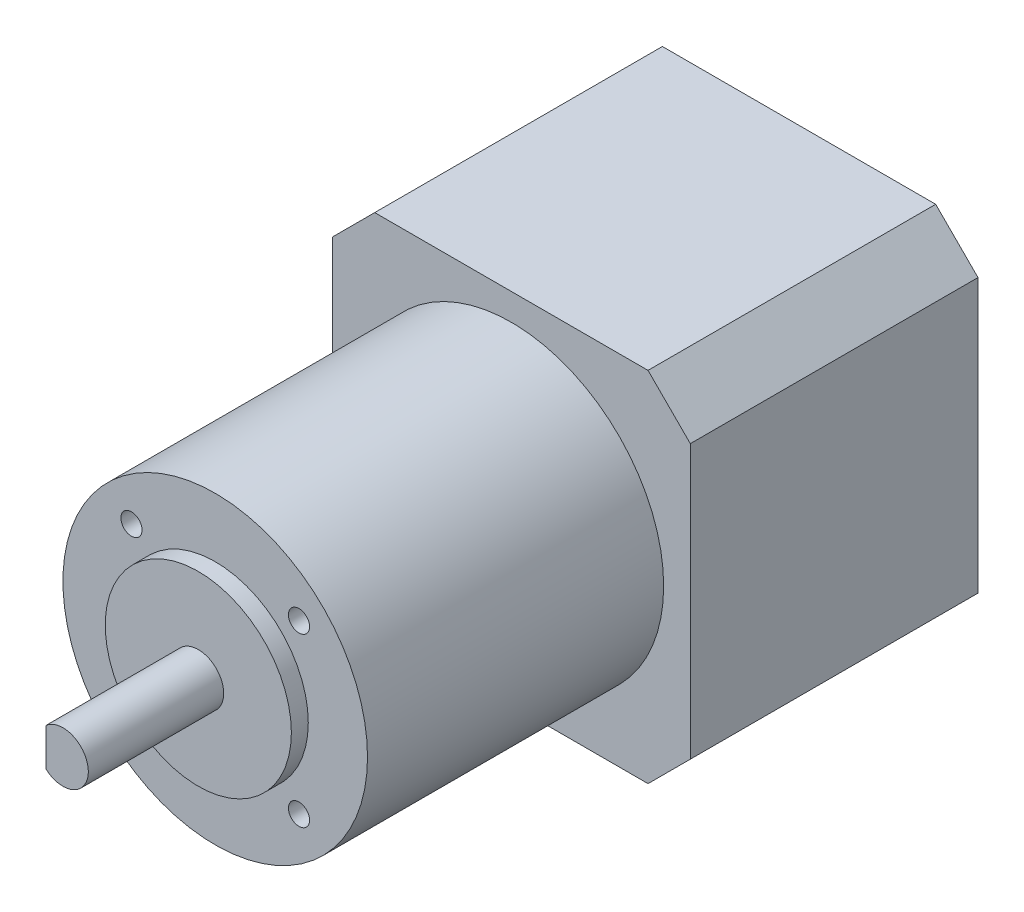
ISO-10303-21;
HEADER;
FILE_DESCRIPTION(('STEP AP214'),'2;1');
FILE_NAME('part.step','',(''),(''),'','','');
FILE_SCHEMA(('AUTOMOTIVE_DESIGN { 1 0 10303 214 1 1 1 1 }'));
ENDSEC;
DATA;
#1=APPLICATION_CONTEXT('core data for automotive mechanical design processes');
#2=APPLICATION_PROTOCOL_DEFINITION('international standard','automotive_design',2000,#1);
#3=PRODUCT_CONTEXT('',#1,'mechanical');
#4=PRODUCT('Part','Part','',(#3));
#5=PRODUCT_RELATED_PRODUCT_CATEGORY('part','',(#4));
#6=PRODUCT_DEFINITION_FORMATION('','',#4);
#7=PRODUCT_DEFINITION_CONTEXT('part definition',#1,'design');
#8=PRODUCT_DEFINITION('design','',#6,#7);
#9=PRODUCT_DEFINITION_SHAPE('','',#8);
#10=(LENGTH_UNIT() NAMED_UNIT(*) SI_UNIT(.MILLI.,.METRE.));
#11=(NAMED_UNIT(*) PLANE_ANGLE_UNIT() SI_UNIT($,.RADIAN.));
#12=(NAMED_UNIT(*) SI_UNIT($,.STERADIAN.) SOLID_ANGLE_UNIT());
#13=UNCERTAINTY_MEASURE_WITH_UNIT(LENGTH_MEASURE(1.E-05),#10,'distance_accuracy_value','');
#14=(GEOMETRIC_REPRESENTATION_CONTEXT(3) GLOBAL_UNCERTAINTY_ASSIGNED_CONTEXT((#13)) GLOBAL_UNIT_ASSIGNED_CONTEXT((#10,
#11,#12)) REPRESENTATION_CONTEXT('',''));
#15=CARTESIAN_POINT('',(0.,0.,0.));
#16=DIRECTION('',(0.,0.,1.));
#17=DIRECTION('',(1.,0.,0.));
#18=AXIS2_PLACEMENT_3D('',#15,#16,#17);
#19=CARTESIAN_POINT('',(-21.15,-21.15,34.));
#20=DIRECTION('',(-1.,0.,0.));
#21=DIRECTION('',(0.,0.,1.));
#22=AXIS2_PLACEMENT_3D('',#19,#20,#21);
#23=PLANE('',#22);
#24=DIRECTION('',(0.,1.,0.));
#25=VECTOR('',#24,1.);
#26=CARTESIAN_POINT('',(-21.15,-21.15,0.));
#27=LINE('',#26,#25);
#28=CARTESIAN_POINT('',(-21.15,-16.15,0.));
#29=VERTEX_POINT('',#28);
#30=CARTESIAN_POINT('',(-21.15,16.15,0.));
#31=VERTEX_POINT('',#30);
#32=EDGE_CURVE('E197',#29,#31,#27,.T.);
#33=ORIENTED_EDGE('',*,*,#32,.F.);
#34=DIRECTION('',(0.,0.,1.));
#35=VECTOR('',#34,1.);
#36=CARTESIAN_POINT('',(-21.15,-16.15,34.));
#37=LINE('',#36,#35);
#38=CARTESIAN_POINT('',(-21.15,-16.15,34.));
#39=VERTEX_POINT('',#38);
#40=EDGE_CURVE('E236',#29,#39,#37,.T.);
#41=ORIENTED_EDGE('',*,*,#40,.T.);
#42=DIRECTION('',(0.,1.,0.));
#43=VECTOR('',#42,1.);
#44=CARTESIAN_POINT('',(-21.15,-21.15,34.));
#45=LINE('',#44,#43);
#46=CARTESIAN_POINT('',(-21.15,16.15,34.));
#47=VERTEX_POINT('',#46);
#48=EDGE_CURVE('E201',#39,#47,#45,.T.);
#49=ORIENTED_EDGE('',*,*,#48,.T.);
#50=DIRECTION('',(0.,0.,-1.));
#51=VECTOR('',#50,1.);
#52=CARTESIAN_POINT('',(-21.15,16.15,34.));
#53=LINE('',#52,#51);
#54=EDGE_CURVE('E233',#47,#31,#53,.T.);
#55=ORIENTED_EDGE('',*,*,#54,.T.);
#56=EDGE_LOOP('',(#33,#41,#49,#55));
#57=FACE_BOUND('',#56,.T.);
#58=ADVANCED_FACE('F47',(#57),#23,.T.);
#59=CARTESIAN_POINT('',(-21.15,-21.15,34.));
#60=DIRECTION('',(0.,1.,0.));
#61=DIRECTION('',(0.,0.,1.));
#62=AXIS2_PLACEMENT_3D('',#59,#60,#61);
#63=PLANE('',#62);
#64=DIRECTION('',(1.,0.,0.));
#65=VECTOR('',#64,1.);
#66=CARTESIAN_POINT('',(-21.15,-21.15,34.));
#67=LINE('',#66,#65);
#68=CARTESIAN_POINT('',(-16.15,-21.15,34.));
#69=VERTEX_POINT('',#68);
#70=CARTESIAN_POINT('',(16.15,-21.15,34.));
#71=VERTEX_POINT('',#70);
#72=EDGE_CURVE('E200',#69,#71,#67,.T.);
#73=ORIENTED_EDGE('',*,*,#72,.F.);
#74=DIRECTION('',(0.,0.,-1.));
#75=VECTOR('',#74,1.);
#76=CARTESIAN_POINT('',(-16.15,-21.15,0.));
#77=LINE('',#76,#75);
#78=CARTESIAN_POINT('',(-16.15,-21.15,0.));
#79=VERTEX_POINT('',#78);
#80=EDGE_CURVE('E222',#69,#79,#77,.T.);
#81=ORIENTED_EDGE('',*,*,#80,.T.);
#82=DIRECTION('',(1.,0.,0.));
#83=VECTOR('',#82,1.);
#84=CARTESIAN_POINT('',(-21.15,-21.15,0.));
#85=LINE('',#84,#83);
#86=CARTESIAN_POINT('',(16.15,-21.15,0.));
#87=VERTEX_POINT('',#86);
#88=EDGE_CURVE('E205',#79,#87,#85,.T.);
#89=ORIENTED_EDGE('',*,*,#88,.T.);
#90=DIRECTION('',(0.,0.,1.));
#91=VECTOR('',#90,1.);
#92=CARTESIAN_POINT('',(16.15,-21.15,34.));
#93=LINE('',#92,#91);
#94=EDGE_CURVE('E187',#87,#71,#93,.T.);
#95=ORIENTED_EDGE('',*,*,#94,.T.);
#96=EDGE_LOOP('',(#73,#81,#89,#95));
#97=FACE_BOUND('',#96,.T.);
#98=ADVANCED_FACE('F272',(#97),#63,.F.);
#99=CARTESIAN_POINT('',(21.15,-21.15,34.));
#100=DIRECTION('',(-1.,0.,0.));
#101=DIRECTION('',(0.,0.,1.));
#102=AXIS2_PLACEMENT_3D('',#99,#100,#101);
#103=PLANE('',#102);
#104=DIRECTION('',(0.,1.,0.));
#105=VECTOR('',#104,1.);
#106=CARTESIAN_POINT('',(21.15,-21.15,34.));
#107=LINE('',#106,#105);
#108=CARTESIAN_POINT('',(21.15,-16.15,34.));
#109=VERTEX_POINT('',#108);
#110=CARTESIAN_POINT('',(21.15,16.15,34.));
#111=VERTEX_POINT('',#110);
#112=EDGE_CURVE('E207',#109,#111,#107,.T.);
#113=ORIENTED_EDGE('',*,*,#112,.F.);
#114=DIRECTION('',(0.,0.,-1.));
#115=VECTOR('',#114,1.);
#116=CARTESIAN_POINT('',(21.15,-16.15,34.));
#117=LINE('',#116,#115);
#118=CARTESIAN_POINT('',(21.15,-16.15,0.));
#119=VERTEX_POINT('',#118);
#120=EDGE_CURVE('E247',#109,#119,#117,.T.);
#121=ORIENTED_EDGE('',*,*,#120,.T.);
#122=DIRECTION('',(0.,1.,0.));
#123=VECTOR('',#122,1.);
#124=CARTESIAN_POINT('',(21.15,-21.15,0.));
#125=LINE('',#124,#123);
#126=CARTESIAN_POINT('',(21.15,16.15,0.));
#127=VERTEX_POINT('',#126);
#128=EDGE_CURVE('E216',#119,#127,#125,.T.);
#129=ORIENTED_EDGE('',*,*,#128,.T.);
#130=DIRECTION('',(0.,0.,1.));
#131=VECTOR('',#130,1.);
#132=CARTESIAN_POINT('',(21.15,16.15,34.));
#133=LINE('',#132,#131);
#134=EDGE_CURVE('E245',#127,#111,#133,.T.);
#135=ORIENTED_EDGE('',*,*,#134,.T.);
#136=EDGE_LOOP('',(#113,#121,#129,#135));
#137=FACE_BOUND('',#136,.T.);
#138=ADVANCED_FACE('F280',(#137),#103,.F.);
#139=CARTESIAN_POINT('',(-21.15,21.15,34.));
#140=DIRECTION('',(0.,1.,0.));
#141=DIRECTION('',(0.,0.,1.));
#142=AXIS2_PLACEMENT_3D('',#139,#140,#141);
#143=PLANE('',#142);
#144=DIRECTION('',(1.,0.,0.));
#145=VECTOR('',#144,1.);
#146=CARTESIAN_POINT('',(-21.15,21.15,0.));
#147=LINE('',#146,#145);
#148=CARTESIAN_POINT('',(-16.15,21.15,0.));
#149=VERTEX_POINT('',#148);
#150=CARTESIAN_POINT('',(16.15,21.15,0.));
#151=VERTEX_POINT('',#150);
#152=EDGE_CURVE('E213',#149,#151,#147,.T.);
#153=ORIENTED_EDGE('',*,*,#152,.F.);
#154=DIRECTION('',(0.,0.,1.));
#155=VECTOR('',#154,1.);
#156=CARTESIAN_POINT('',(-16.15,21.15,34.));
#157=LINE('',#156,#155);
#158=CARTESIAN_POINT('',(-16.15,21.15,34.));
#159=VERTEX_POINT('',#158);
#160=EDGE_CURVE('E11',#149,#159,#157,.T.);
#161=ORIENTED_EDGE('',*,*,#160,.T.);
#162=DIRECTION('',(1.,0.,0.));
#163=VECTOR('',#162,1.);
#164=CARTESIAN_POINT('',(-21.15,21.15,34.));
#165=LINE('',#164,#163);
#166=CARTESIAN_POINT('',(16.15,21.15,34.));
#167=VERTEX_POINT('',#166);
#168=EDGE_CURVE('E204',#159,#167,#165,.T.);
#169=ORIENTED_EDGE('',*,*,#168,.T.);
#170=DIRECTION('',(0.,0.,-1.));
#171=VECTOR('',#170,1.);
#172=CARTESIAN_POINT('',(16.15,21.15,0.));
#173=LINE('',#172,#171);
#174=EDGE_CURVE('E56',#167,#151,#173,.T.);
#175=ORIENTED_EDGE('',*,*,#174,.T.);
#176=EDGE_LOOP('',(#153,#161,#169,#175));
#177=FACE_BOUND('',#176,.T.);
#178=ADVANCED_FACE('F251',(#177),#143,.T.);
#179=CARTESIAN_POINT('',(0.,0.,34.));
#180=DIRECTION('',(0.,0.,-1.));
#181=DIRECTION('',(-1.,0.,0.));
#182=AXIS2_PLACEMENT_3D('',#179,#180,#181);
#183=PLANE('',#182);
#184=CARTESIAN_POINT('',(0.,0.,34.));
#185=DIRECTION('',(0.,0.,1.));
#186=DIRECTION('',(1.,0.,0.));
#187=AXIS2_PLACEMENT_3D('',#184,#185,#186);
#188=CIRCLE('',#187,18.);
#189=CARTESIAN_POINT('',(18.,0.,34.));
#190=VERTEX_POINT('',#189);
#191=EDGE_CURVE('E194',#190,#190,#188,.T.);
#192=ORIENTED_EDGE('',*,*,#191,.F.);
#193=EDGE_LOOP('',(#192));
#194=FACE_BOUND('',#193,.T.);
#195=ORIENTED_EDGE('',*,*,#48,.F.);
#196=DIRECTION('',(0.707106781186546,-0.707106781186549,0.));
#197=VECTOR('',#196,1.);
#198=CARTESIAN_POINT('',(-16.15,-21.15,34.));
#199=LINE('',#198,#197);
#200=EDGE_CURVE('E243',#39,#69,#199,.T.);
#201=ORIENTED_EDGE('',*,*,#200,.T.);
#202=ORIENTED_EDGE('',*,*,#72,.T.);
#203=DIRECTION('',(-0.707106781186549,-0.707106781186546,0.));
#204=VECTOR('',#203,1.);
#205=CARTESIAN_POINT('',(21.15,-16.15,34.));
#206=LINE('',#205,#204);
#207=EDGE_CURVE('E241',#71,#109,#206,.F.);
#208=ORIENTED_EDGE('',*,*,#207,.T.);
#209=ORIENTED_EDGE('',*,*,#112,.T.);
#210=DIRECTION('',(-0.707106781186546,0.707106781186549,0.));
#211=VECTOR('',#210,1.);
#212=CARTESIAN_POINT('',(16.15,21.15,34.));
#213=LINE('',#212,#211);
#214=EDGE_CURVE('E63',#111,#167,#213,.T.);
#215=ORIENTED_EDGE('',*,*,#214,.T.);
#216=ORIENTED_EDGE('',*,*,#168,.F.);
#217=DIRECTION('',(0.707106781186549,0.707106781186546,0.));
#218=VECTOR('',#217,1.);
#219=CARTESIAN_POINT('',(-21.15,16.15,34.));
#220=LINE('',#219,#218);
#221=EDGE_CURVE('E239',#159,#47,#220,.F.);
#222=ORIENTED_EDGE('',*,*,#221,.T.);
#223=EDGE_LOOP('',(#195,#201,#202,#208,#209,#215,#216,#222));
#224=FACE_BOUND('',#223,.T.);
#225=ADVANCED_FACE('F266',(#194,#224),#183,.F.);
#226=CARTESIAN_POINT('',(0.,0.,0.));
#227=DIRECTION('',(0.,0.,-1.));
#228=DIRECTION('',(-1.,0.,0.));
#229=AXIS2_PLACEMENT_3D('',#226,#227,#228);
#230=PLANE('',#229);
#231=ORIENTED_EDGE('',*,*,#88,.F.);
#232=DIRECTION('',(-0.707106781186546,0.707106781186549,0.));
#233=VECTOR('',#232,1.);
#234=CARTESIAN_POINT('',(-18.65,-18.6499999999999,0.));
#235=LINE('',#234,#233);
#236=EDGE_CURVE('E231',#79,#29,#235,.T.);
#237=ORIENTED_EDGE('',*,*,#236,.T.);
#238=ORIENTED_EDGE('',*,*,#32,.T.);
#239=DIRECTION('',(-0.707106781186549,-0.707106781186546,0.));
#240=VECTOR('',#239,1.);
#241=CARTESIAN_POINT('',(-18.6499999999999,18.65,0.));
#242=LINE('',#241,#240);
#243=EDGE_CURVE('E227',#31,#149,#242,.F.);
#244=ORIENTED_EDGE('',*,*,#243,.T.);
#245=ORIENTED_EDGE('',*,*,#152,.T.);
#246=DIRECTION('',(0.707106781186546,-0.707106781186549,0.));
#247=VECTOR('',#246,1.);
#248=CARTESIAN_POINT('',(18.65,18.6499999999999,0.));
#249=LINE('',#248,#247);
#250=EDGE_CURVE('E225',#151,#127,#249,.T.);
#251=ORIENTED_EDGE('',*,*,#250,.T.);
#252=ORIENTED_EDGE('',*,*,#128,.F.);
#253=DIRECTION('',(0.707106781186549,0.707106781186546,0.));
#254=VECTOR('',#253,1.);
#255=CARTESIAN_POINT('',(18.6499999999999,-18.65,0.));
#256=LINE('',#255,#254);
#257=EDGE_CURVE('E229',#119,#87,#256,.F.);
#258=ORIENTED_EDGE('',*,*,#257,.T.);
#259=EDGE_LOOP('',(#231,#237,#238,#244,#245,#251,#252,#258));
#260=FACE_BOUND('',#259,.T.);
#261=ADVANCED_FACE('F255',(#260),#230,.T.);
#262=CARTESIAN_POINT('',(0.,0.,69.));
#263=DIRECTION('',(0.,0.,-1.));
#264=DIRECTION('',(-1.,0.,0.));
#265=AXIS2_PLACEMENT_3D('',#262,#263,#264);
#266=CYLINDRICAL_SURFACE('',#265,18.);
#267=CARTESIAN_POINT('',(0.,0.,69.));
#268=DIRECTION('',(0.,0.,1.));
#269=DIRECTION('',(1.,0.,0.));
#270=AXIS2_PLACEMENT_3D('',#267,#268,#269);
#271=CIRCLE('',#270,18.);
#272=CARTESIAN_POINT('',(18.,0.,69.));
#273=VERTEX_POINT('',#272);
#274=EDGE_CURVE('E191',#273,#273,#271,.T.);
#275=ORIENTED_EDGE('',*,*,#274,.F.);
#276=EDGE_LOOP('',(#275));
#277=FACE_BOUND('',#276,.T.);
#278=ORIENTED_EDGE('',*,*,#191,.T.);
#279=EDGE_LOOP('',(#278));
#280=FACE_BOUND('',#279,.T.);
#281=ADVANCED_FACE('F343',(#277,#280),#266,.T.);
#282=CARTESIAN_POINT('',(0.,0.,69.));
#283=DIRECTION('',(0.,0.,1.));
#284=DIRECTION('',(1.,0.,0.));
#285=AXIS2_PLACEMENT_3D('',#282,#283,#284);
#286=PLANE('',#285);
#287=CARTESIAN_POINT('',(-9.89949493661167,9.89949493661167,69.));
#288=DIRECTION('',(0.,0.,1.));
#289=DIRECTION('',(1.,0.,0.));
#290=AXIS2_PLACEMENT_3D('',#287,#288,#289);
#291=CIRCLE('',#290,1.24999999999999);
#292=CARTESIAN_POINT('',(-8.64949493661168,9.89949493661167,69.));
#293=VERTEX_POINT('',#292);
#294=EDGE_CURVE('E146',#293,#293,#291,.T.);
#295=ORIENTED_EDGE('',*,*,#294,.F.);
#296=EDGE_LOOP('',(#295));
#297=FACE_BOUND('',#296,.T.);
#298=CARTESIAN_POINT('',(9.89949493661167,9.89949493661167,69.));
#299=DIRECTION('',(0.,0.,1.));
#300=DIRECTION('',(1.,0.,0.));
#301=AXIS2_PLACEMENT_3D('',#298,#299,#300);
#302=CIRCLE('',#301,1.24999999999999);
#303=CARTESIAN_POINT('',(11.1494949366117,9.89949493661167,69.));
#304=VERTEX_POINT('',#303);
#305=EDGE_CURVE('E145',#304,#304,#302,.T.);
#306=ORIENTED_EDGE('',*,*,#305,.F.);
#307=EDGE_LOOP('',(#306));
#308=FACE_BOUND('',#307,.T.);
#309=CARTESIAN_POINT('',(9.89949493661167,-9.89949493661167,69.));
#310=DIRECTION('',(0.,0.,1.));
#311=DIRECTION('',(1.,0.,0.));
#312=AXIS2_PLACEMENT_3D('',#309,#310,#311);
#313=CIRCLE('',#312,1.24999999999999);
#314=CARTESIAN_POINT('',(11.1494949366117,-9.89949493661167,69.));
#315=VERTEX_POINT('',#314);
#316=EDGE_CURVE('E156',#315,#315,#313,.T.);
#317=ORIENTED_EDGE('',*,*,#316,.F.);
#318=EDGE_LOOP('',(#317));
#319=FACE_BOUND('',#318,.T.);
#320=CARTESIAN_POINT('',(-9.89949493661167,-9.89949493661167,69.));
#321=DIRECTION('',(0.,0.,1.));
#322=DIRECTION('',(1.,0.,0.));
#323=AXIS2_PLACEMENT_3D('',#320,#321,#322);
#324=CIRCLE('',#323,1.24999999999999);
#325=CARTESIAN_POINT('',(-8.64949493661168,-9.89949493661167,69.));
#326=VERTEX_POINT('',#325);
#327=EDGE_CURVE('E162',#326,#326,#324,.T.);
#328=ORIENTED_EDGE('',*,*,#327,.F.);
#329=EDGE_LOOP('',(#328));
#330=FACE_BOUND('',#329,.T.);
#331=CARTESIAN_POINT('',(0.,0.,69.));
#332=DIRECTION('',(0.,0.,1.));
#333=DIRECTION('',(1.,0.,0.));
#334=AXIS2_PLACEMENT_3D('',#331,#332,#333);
#335=CIRCLE('',#334,11.);
#336=CARTESIAN_POINT('',(11.,0.,69.));
#337=VERTEX_POINT('',#336);
#338=EDGE_CURVE('E188',#337,#337,#335,.T.);
#339=ORIENTED_EDGE('',*,*,#338,.F.);
#340=EDGE_LOOP('',(#339));
#341=FACE_BOUND('',#340,.T.);
#342=ORIENTED_EDGE('',*,*,#274,.T.);
#343=EDGE_LOOP('',(#342));
#344=FACE_BOUND('',#343,.T.);
#345=ADVANCED_FACE('F336',(#297,#308,#319,#330,#341,#344),#286,.T.);
#346=CARTESIAN_POINT('',(0.,0.,71.));
#347=DIRECTION('',(0.,0.,-1.));
#348=DIRECTION('',(-1.,0.,0.));
#349=AXIS2_PLACEMENT_3D('',#346,#347,#348);
#350=CYLINDRICAL_SURFACE('',#349,11.);
#351=CARTESIAN_POINT('',(0.,0.,71.));
#352=DIRECTION('',(0.,0.,1.));
#353=DIRECTION('',(1.,0.,0.));
#354=AXIS2_PLACEMENT_3D('',#351,#352,#353);
#355=CIRCLE('',#354,11.);
#356=CARTESIAN_POINT('',(11.,0.,71.));
#357=VERTEX_POINT('',#356);
#358=EDGE_CURVE('E183',#357,#357,#355,.T.);
#359=ORIENTED_EDGE('',*,*,#358,.F.);
#360=EDGE_LOOP('',(#359));
#361=FACE_BOUND('',#360,.T.);
#362=ORIENTED_EDGE('',*,*,#338,.T.);
#363=EDGE_LOOP('',(#362));
#364=FACE_BOUND('',#363,.T.);
#365=ADVANCED_FACE('F342',(#361,#364),#350,.T.);
#366=CARTESIAN_POINT('',(0.,0.,71.));
#367=DIRECTION('',(0.,0.,1.));
#368=DIRECTION('',(1.,0.,0.));
#369=AXIS2_PLACEMENT_3D('',#366,#367,#368);
#370=PLANE('',#369);
#371=CARTESIAN_POINT('',(0.,0.,71.));
#372=DIRECTION('',(0.,0.,1.));
#373=DIRECTION('',(1.,0.,0.));
#374=AXIS2_PLACEMENT_3D('',#371,#372,#373);
#375=CIRCLE('',#374,3.);
#376=CARTESIAN_POINT('',(3.,0.,71.));
#377=VERTEX_POINT('',#376);
#378=EDGE_CURVE('E184',#377,#377,#375,.T.);
#379=ORIENTED_EDGE('',*,*,#378,.F.);
#380=EDGE_LOOP('',(#379));
#381=FACE_BOUND('',#380,.T.);
#382=ORIENTED_EDGE('',*,*,#358,.T.);
#383=EDGE_LOOP('',(#382));
#384=FACE_BOUND('',#383,.T.);
#385=ADVANCED_FACE('F471',(#381,#384),#370,.T.);
#386=CARTESIAN_POINT('',(0.,0.,87.));
#387=DIRECTION('',(0.,0.,-1.));
#388=DIRECTION('',(-1.,0.,0.));
#389=AXIS2_PLACEMENT_3D('',#386,#387,#388);
#390=CYLINDRICAL_SURFACE('',#389,3.);
#391=CARTESIAN_POINT('',(0.,0.,87.));
#392=DIRECTION('',(0.,0.,1.));
#393=DIRECTION('',(1.,0.,0.));
#394=AXIS2_PLACEMENT_3D('',#391,#392,#393);
#395=CIRCLE('',#394,3.);
#396=CARTESIAN_POINT('',(-2.,-2.23606797749979,87.));
#397=VERTEX_POINT('',#396);
#398=CARTESIAN_POINT('',(-2.,2.23606797749979,87.));
#399=VERTEX_POINT('',#398);
#400=EDGE_CURVE('E179',#397,#399,#395,.T.);
#401=ORIENTED_EDGE('',*,*,#400,.F.);
#402=DIRECTION('',(0.,0.,1.));
#403=VECTOR('',#402,1.);
#404=CARTESIAN_POINT('',(-2.,-2.23606797749979,75.));
#405=LINE('',#404,#403);
#406=CARTESIAN_POINT('',(-2.,-2.23606797749979,75.));
#407=VERTEX_POINT('',#406);
#408=EDGE_CURVE('E174',#407,#397,#405,.T.);
#409=ORIENTED_EDGE('',*,*,#408,.F.);
#410=CARTESIAN_POINT('',(0.,0.,75.));
#411=DIRECTION('',(0.,0.,1.));
#412=DIRECTION('',(1.,0.,0.));
#413=AXIS2_PLACEMENT_3D('',#410,#411,#412);
#414=CIRCLE('',#413,3.);
#415=CARTESIAN_POINT('',(-2.,2.23606797749979,75.));
#416=VERTEX_POINT('',#415);
#417=EDGE_CURVE('E169',#416,#407,#414,.T.);
#418=ORIENTED_EDGE('',*,*,#417,.F.);
#419=DIRECTION('',(0.,0.,1.));
#420=VECTOR('',#419,1.);
#421=CARTESIAN_POINT('',(-2.,2.23606797749979,75.));
#422=LINE('',#421,#420);
#423=EDGE_CURVE('E176',#416,#399,#422,.T.);
#424=ORIENTED_EDGE('',*,*,#423,.T.);
#425=EDGE_LOOP('',(#401,#409,#418,#424));
#426=FACE_BOUND('',#425,.T.);
#427=ORIENTED_EDGE('',*,*,#378,.T.);
#428=EDGE_LOOP('',(#427));
#429=FACE_BOUND('',#428,.T.);
#430=ADVANCED_FACE('F478',(#426,#429),#390,.T.);
#431=CARTESIAN_POINT('',(0.,0.,87.));
#432=DIRECTION('',(0.,0.,1.));
#433=DIRECTION('',(1.,0.,0.));
#434=AXIS2_PLACEMENT_3D('',#431,#432,#433);
#435=PLANE('',#434);
#436=DIRECTION('',(0.,1.,0.));
#437=VECTOR('',#436,1.);
#438=CARTESIAN_POINT('',(-2.,2.23606797749979,87.));
#439=LINE('',#438,#437);
#440=EDGE_CURVE('E168',#397,#399,#439,.T.);
#441=ORIENTED_EDGE('',*,*,#440,.F.);
#442=ORIENTED_EDGE('',*,*,#400,.T.);
#443=EDGE_LOOP('',(#441,#442));
#444=FACE_BOUND('',#443,.T.);
#445=ADVANCED_FACE('F486',(#444),#435,.T.);
#446=CARTESIAN_POINT('',(-2.,2.23606797749979,75.));
#447=DIRECTION('',(1.,0.,0.));
#448=DIRECTION('',(0.,0.,-1.));
#449=AXIS2_PLACEMENT_3D('',#446,#447,#448);
#450=PLANE('',#449);
#451=ORIENTED_EDGE('',*,*,#440,.T.);
#452=ORIENTED_EDGE('',*,*,#423,.F.);
#453=DIRECTION('',(0.,1.,0.));
#454=VECTOR('',#453,1.);
#455=CARTESIAN_POINT('',(-2.,2.23606797749979,75.));
#456=LINE('',#455,#454);
#457=EDGE_CURVE('E171',#407,#416,#456,.T.);
#458=ORIENTED_EDGE('',*,*,#457,.F.);
#459=ORIENTED_EDGE('',*,*,#408,.T.);
#460=EDGE_LOOP('',(#451,#452,#458,#459));
#461=FACE_BOUND('',#460,.T.);
#462=ADVANCED_FACE('F494',(#461),#450,.F.);
#463=CARTESIAN_POINT('',(0.,0.,75.));
#464=DIRECTION('',(0.,0.,1.));
#465=DIRECTION('',(1.,0.,0.));
#466=AXIS2_PLACEMENT_3D('',#463,#464,#465);
#467=PLANE('',#466);
#468=ORIENTED_EDGE('',*,*,#417,.T.);
#469=ORIENTED_EDGE('',*,*,#457,.T.);
#470=EDGE_LOOP('',(#468,#469));
#471=FACE_BOUND('',#470,.T.);
#472=ADVANCED_FACE('F306',(#471),#467,.T.);
#473=CARTESIAN_POINT('',(-16.15,-21.15,34.));
#474=DIRECTION('',(-0.707106781186549,-0.707106781186545,0.));
#475=DIRECTION('',(0.,0.,1.));
#476=AXIS2_PLACEMENT_3D('',#473,#474,#475);
#477=PLANE('',#476);
#478=ORIENTED_EDGE('',*,*,#200,.F.);
#479=ORIENTED_EDGE('',*,*,#40,.F.);
#480=ORIENTED_EDGE('',*,*,#236,.F.);
#481=ORIENTED_EDGE('',*,*,#80,.F.);
#482=EDGE_LOOP('',(#478,#479,#480,#481));
#483=FACE_BOUND('',#482,.T.);
#484=ADVANCED_FACE('F270',(#483),#477,.T.);
#485=CARTESIAN_POINT('',(21.15,-16.15,34.));
#486=DIRECTION('',(-0.707106781186545,0.707106781186549,0.));
#487=DIRECTION('',(0.,0.,-1.));
#488=AXIS2_PLACEMENT_3D('',#485,#486,#487);
#489=PLANE('',#488);
#490=ORIENTED_EDGE('',*,*,#207,.F.);
#491=ORIENTED_EDGE('',*,*,#94,.F.);
#492=ORIENTED_EDGE('',*,*,#257,.F.);
#493=ORIENTED_EDGE('',*,*,#120,.F.);
#494=EDGE_LOOP('',(#490,#491,#492,#493));
#495=FACE_BOUND('',#494,.T.);
#496=ADVANCED_FACE('F277',(#495),#489,.F.);
#497=CARTESIAN_POINT('',(-21.15,16.15,34.));
#498=DIRECTION('',(0.707106781186545,-0.707106781186549,0.));
#499=DIRECTION('',(0.,0.,-1.));
#500=AXIS2_PLACEMENT_3D('',#497,#498,#499);
#501=PLANE('',#500);
#502=ORIENTED_EDGE('',*,*,#221,.F.);
#503=ORIENTED_EDGE('',*,*,#160,.F.);
#504=ORIENTED_EDGE('',*,*,#243,.F.);
#505=ORIENTED_EDGE('',*,*,#54,.F.);
#506=EDGE_LOOP('',(#502,#503,#504,#505));
#507=FACE_BOUND('',#506,.T.);
#508=ADVANCED_FACE('F261',(#507),#501,.F.);
#509=CARTESIAN_POINT('',(16.15,21.15,34.));
#510=DIRECTION('',(0.707106781186549,0.707106781186545,0.));
#511=DIRECTION('',(0.,0.,1.));
#512=AXIS2_PLACEMENT_3D('',#509,#510,#511);
#513=PLANE('',#512);
#514=ORIENTED_EDGE('',*,*,#214,.F.);
#515=ORIENTED_EDGE('',*,*,#134,.F.);
#516=ORIENTED_EDGE('',*,*,#250,.F.);
#517=ORIENTED_EDGE('',*,*,#174,.F.);
#518=EDGE_LOOP('',(#514,#515,#516,#517));
#519=FACE_BOUND('',#518,.T.);
#520=ADVANCED_FACE('F50',(#519),#513,.T.);
#521=CARTESIAN_POINT('',(-9.89949493661167,-9.89949493661167,61.5));
#522=DIRECTION('',(0.,0.,1.));
#523=DIRECTION('',(1.,0.,0.));
#524=AXIS2_PLACEMENT_3D('',#521,#522,#523);
#525=CONICAL_SURFACE('',#524,1.25,1.02974425867665);
#526=CARTESIAN_POINT('',(-9.89949493661167,-9.89949493661167,60.7489242262156));
#527=VERTEX_POINT('',#526);
#528=VERTEX_LOOP('',#527);
#529=FACE_BOUND('',#528,.T.);
#530=CARTESIAN_POINT('',(-9.89949493661167,-9.89949493661167,61.5));
#531=DIRECTION('',(0.,0.,1.));
#532=DIRECTION('',(1.,0.,0.));
#533=AXIS2_PLACEMENT_3D('',#530,#531,#532);
#534=CIRCLE('',#533,1.25);
#535=CARTESIAN_POINT('',(-8.64949493661167,-9.89949493661167,61.5));
#536=VERTEX_POINT('',#535);
#537=EDGE_CURVE('E165',#536,#536,#534,.T.);
#538=ORIENTED_EDGE('',*,*,#537,.T.);
#539=EDGE_LOOP('',(#538));
#540=FACE_BOUND('',#539,.T.);
#541=ADVANCED_FACE('F283',(#529,#540),#525,.F.);
#542=CARTESIAN_POINT('',(-9.89949493661167,-9.89949493661167,69.));
#543=DIRECTION('',(0.,0.,1.));
#544=DIRECTION('',(1.,0.,0.));
#545=AXIS2_PLACEMENT_3D('',#542,#543,#544);
#546=CYLINDRICAL_SURFACE('',#545,1.24999999999999);
#547=ORIENTED_EDGE('',*,*,#537,.F.);
#548=EDGE_LOOP('',(#547));
#549=FACE_BOUND('',#548,.T.);
#550=ORIENTED_EDGE('',*,*,#327,.T.);
#551=EDGE_LOOP('',(#550));
#552=FACE_BOUND('',#551,.T.);
#553=ADVANCED_FACE('F288',(#549,#552),#546,.F.);
#554=CARTESIAN_POINT('',(9.89949493661167,-9.89949493661167,61.5));
#555=DIRECTION('',(0.,0.,1.));
#556=DIRECTION('',(1.,0.,0.));
#557=AXIS2_PLACEMENT_3D('',#554,#555,#556);
#558=CONICAL_SURFACE('',#557,1.25,1.02974425867665);
#559=CARTESIAN_POINT('',(9.89949493661167,-9.89949493661167,60.7489242262156));
#560=VERTEX_POINT('',#559);
#561=VERTEX_LOOP('',#560);
#562=FACE_BOUND('',#561,.T.);
#563=CARTESIAN_POINT('',(9.89949493661167,-9.89949493661167,61.5));
#564=DIRECTION('',(0.,0.,1.));
#565=DIRECTION('',(1.,0.,0.));
#566=AXIS2_PLACEMENT_3D('',#563,#564,#565);
#567=CIRCLE('',#566,1.25);
#568=CARTESIAN_POINT('',(11.1494949366117,-9.89949493661167,61.5));
#569=VERTEX_POINT('',#568);
#570=EDGE_CURVE('E159',#569,#569,#567,.T.);
#571=ORIENTED_EDGE('',*,*,#570,.T.);
#572=EDGE_LOOP('',(#571));
#573=FACE_BOUND('',#572,.T.);
#574=ADVANCED_FACE('F365',(#562,#573),#558,.F.);
#575=CARTESIAN_POINT('',(9.89949493661167,-9.89949493661167,69.));
#576=DIRECTION('',(0.,0.,1.));
#577=DIRECTION('',(1.,0.,0.));
#578=AXIS2_PLACEMENT_3D('',#575,#576,#577);
#579=CYLINDRICAL_SURFACE('',#578,1.24999999999999);
#580=ORIENTED_EDGE('',*,*,#570,.F.);
#581=EDGE_LOOP('',(#580));
#582=FACE_BOUND('',#581,.T.);
#583=ORIENTED_EDGE('',*,*,#316,.T.);
#584=EDGE_LOOP('',(#583));
#585=FACE_BOUND('',#584,.T.);
#586=ADVANCED_FACE('F378',(#582,#585),#579,.F.);
#587=CARTESIAN_POINT('',(9.89949493661167,9.89949493661167,61.5));
#588=DIRECTION('',(0.,0.,1.));
#589=DIRECTION('',(1.,0.,0.));
#590=AXIS2_PLACEMENT_3D('',#587,#588,#589);
#591=CONICAL_SURFACE('',#590,1.25,1.02974425867665);
#592=CARTESIAN_POINT('',(9.89949493661167,9.89949493661167,60.7489242262156));
#593=VERTEX_POINT('',#592);
#594=VERTEX_LOOP('',#593);
#595=FACE_BOUND('',#594,.T.);
#596=CARTESIAN_POINT('',(9.89949493661167,9.89949493661167,61.5));
#597=DIRECTION('',(0.,0.,1.));
#598=DIRECTION('',(1.,0.,0.));
#599=AXIS2_PLACEMENT_3D('',#596,#597,#598);
#600=CIRCLE('',#599,1.25);
#601=CARTESIAN_POINT('',(11.1494949366117,9.89949493661167,61.5));
#602=VERTEX_POINT('',#601);
#603=EDGE_CURVE('E149',#602,#602,#600,.T.);
#604=ORIENTED_EDGE('',*,*,#603,.T.);
#605=EDGE_LOOP('',(#604));
#606=FACE_BOUND('',#605,.T.);
#607=ADVANCED_FACE('F389',(#595,#606),#591,.F.);
#608=CARTESIAN_POINT('',(9.89949493661167,9.89949493661167,69.));
#609=DIRECTION('',(0.,0.,1.));
#610=DIRECTION('',(1.,0.,0.));
#611=AXIS2_PLACEMENT_3D('',#608,#609,#610);
#612=CYLINDRICAL_SURFACE('',#611,1.24999999999999);
#613=ORIENTED_EDGE('',*,*,#603,.F.);
#614=EDGE_LOOP('',(#613));
#615=FACE_BOUND('',#614,.T.);
#616=ORIENTED_EDGE('',*,*,#305,.T.);
#617=EDGE_LOOP('',(#616));
#618=FACE_BOUND('',#617,.T.);
#619=ADVANCED_FACE('F139',(#615,#618),#612,.F.);
#620=CARTESIAN_POINT('',(-9.89949493661167,9.89949493661167,61.5));
#621=DIRECTION('',(0.,0.,1.));
#622=DIRECTION('',(1.,0.,0.));
#623=AXIS2_PLACEMENT_3D('',#620,#621,#622);
#624=CONICAL_SURFACE('',#623,1.25,1.02974425867665);
#625=CARTESIAN_POINT('',(-9.89949493661167,9.89949493661167,60.7489242262156));
#626=VERTEX_POINT('',#625);
#627=VERTEX_LOOP('',#626);
#628=FACE_BOUND('',#627,.T.);
#629=CARTESIAN_POINT('',(-9.89949493661167,9.89949493661167,61.5));
#630=DIRECTION('',(0.,0.,1.));
#631=DIRECTION('',(1.,0.,0.));
#632=AXIS2_PLACEMENT_3D('',#629,#630,#631);
#633=CIRCLE('',#632,1.25);
#634=CARTESIAN_POINT('',(-8.64949493661167,9.89949493661167,61.5));
#635=VERTEX_POINT('',#634);
#636=EDGE_CURVE('E143',#635,#635,#633,.T.);
#637=ORIENTED_EDGE('',*,*,#636,.T.);
#638=EDGE_LOOP('',(#637));
#639=FACE_BOUND('',#638,.T.);
#640=ADVANCED_FACE('F135',(#628,#639),#624,.F.);
#641=CARTESIAN_POINT('',(-9.89949493661167,9.89949493661167,69.));
#642=DIRECTION('',(0.,0.,1.));
#643=DIRECTION('',(1.,0.,0.));
#644=AXIS2_PLACEMENT_3D('',#641,#642,#643);
#645=CYLINDRICAL_SURFACE('',#644,1.24999999999999);
#646=ORIENTED_EDGE('',*,*,#636,.F.);
#647=EDGE_LOOP('',(#646));
#648=FACE_BOUND('',#647,.T.);
#649=ORIENTED_EDGE('',*,*,#294,.T.);
#650=EDGE_LOOP('',(#649));
#651=FACE_BOUND('',#650,.T.);
#652=ADVANCED_FACE('F138',(#648,#651),#645,.F.);
#653=CLOSED_SHELL('',(#58,#98,#138,#178,#225,#261,#281,#345,#365,#385,#430,#445,#462,#472,#484,
#496,#508,#520,#541,#553,#574,#586,#607,#619,#640,#652));
#654=MANIFOLD_SOLID_BREP('B2',#653);
#655=ADVANCED_BREP_SHAPE_REPRESENTATION('',(#18,#654),#14);
#656=SHAPE_DEFINITION_REPRESENTATION(#9,#655);
ENDSEC;
END-ISO-10303-21;
